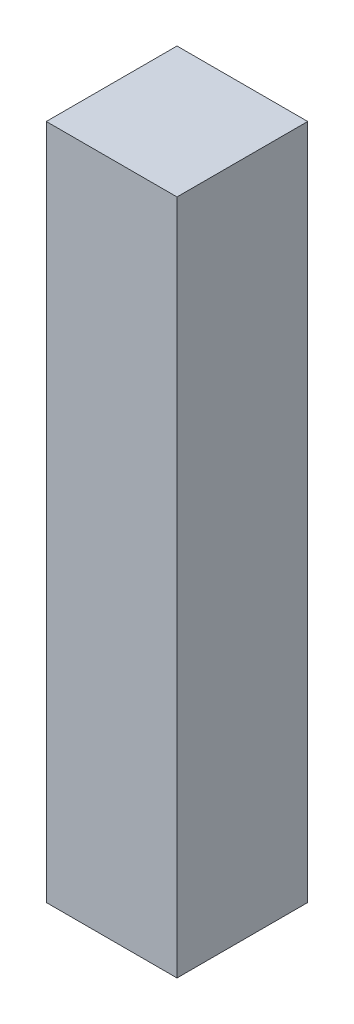
ISO-10303-21;
HEADER;
FILE_DESCRIPTION(('STEP AP214'),'2;1');
FILE_NAME('part.step','',(''),(''),'','','');
FILE_SCHEMA(('AUTOMOTIVE_DESIGN { 1 0 10303 214 1 1 1 1 }'));
ENDSEC;
DATA;
#1=APPLICATION_CONTEXT('core data for automotive mechanical design processes');
#2=APPLICATION_PROTOCOL_DEFINITION('international standard','automotive_design',2000,#1);
#3=PRODUCT_CONTEXT('',#1,'mechanical');
#4=PRODUCT('Part','Part','',(#3));
#5=PRODUCT_RELATED_PRODUCT_CATEGORY('part','',(#4));
#6=PRODUCT_DEFINITION_FORMATION('','',#4);
#7=PRODUCT_DEFINITION_CONTEXT('part definition',#1,'design');
#8=PRODUCT_DEFINITION('design','',#6,#7);
#9=PRODUCT_DEFINITION_SHAPE('','',#8);
#10=(LENGTH_UNIT() NAMED_UNIT(*) SI_UNIT(.MILLI.,.METRE.));
#11=(NAMED_UNIT(*) PLANE_ANGLE_UNIT() SI_UNIT($,.RADIAN.));
#12=(NAMED_UNIT(*) SI_UNIT($,.STERADIAN.) SOLID_ANGLE_UNIT());
#13=UNCERTAINTY_MEASURE_WITH_UNIT(LENGTH_MEASURE(1.E-05),#10,'distance_accuracy_value','');
#14=(GEOMETRIC_REPRESENTATION_CONTEXT(3) GLOBAL_UNCERTAINTY_ASSIGNED_CONTEXT((#13)) GLOBAL_UNIT_ASSIGNED_CONTEXT((#10,
#11,#12)) REPRESENTATION_CONTEXT('',''));
#15=CARTESIAN_POINT('',(0.,0.,0.));
#16=DIRECTION('',(0.,0.,1.));
#17=DIRECTION('',(1.,0.,0.));
#18=AXIS2_PLACEMENT_3D('',#15,#16,#17);
#19=CARTESIAN_POINT('',(0.,388.112,0.));
#20=DIRECTION('',(1.,0.,0.));
#21=DIRECTION('',(0.,0.,-1.));
#22=AXIS2_PLACEMENT_3D('',#19,#20,#21);
#23=PLANE('',#22);
#24=DIRECTION('',(0.,0.,1.));
#25=VECTOR('',#24,1.);
#26=CARTESIAN_POINT('',(0.,0.,0.));
#27=LINE('',#26,#25);
#28=CARTESIAN_POINT('',(0.,0.,-75.));
#29=VERTEX_POINT('',#28);
#30=CARTESIAN_POINT('',(0.,0.,0.));
#31=VERTEX_POINT('',#30);
#32=EDGE_CURVE('E97',#29,#31,#27,.T.);
#33=ORIENTED_EDGE('',*,*,#32,.T.);
#34=DIRECTION('',(0.,-1.,0.));
#35=VECTOR('',#34,1.);
#36=CARTESIAN_POINT('',(0.,388.112,0.));
#37=LINE('',#36,#35);
#38=CARTESIAN_POINT('',(0.,388.112,0.));
#39=VERTEX_POINT('',#38);
#40=EDGE_CURVE('E11',#39,#31,#37,.T.);
#41=ORIENTED_EDGE('',*,*,#40,.F.);
#42=DIRECTION('',(0.,0.,1.));
#43=VECTOR('',#42,1.);
#44=CARTESIAN_POINT('',(0.,388.112,0.));
#45=LINE('',#44,#43);
#46=CARTESIAN_POINT('',(0.,388.112,-75.));
#47=VERTEX_POINT('',#46);
#48=EDGE_CURVE('E85',#47,#39,#45,.T.);
#49=ORIENTED_EDGE('',*,*,#48,.F.);
#50=DIRECTION('',(0.,-1.,0.));
#51=VECTOR('',#50,1.);
#52=CARTESIAN_POINT('',(0.,388.112,-75.));
#53=LINE('',#52,#51);
#54=EDGE_CURVE('E93',#47,#29,#53,.T.);
#55=ORIENTED_EDGE('',*,*,#54,.T.);
#56=EDGE_LOOP('',(#33,#41,#49,#55));
#57=FACE_BOUND('',#56,.T.);
#58=ADVANCED_FACE('F34',(#57),#23,.F.);
#59=CARTESIAN_POINT('',(0.,388.112,0.));
#60=DIRECTION('',(0.,0.,-1.));
#61=DIRECTION('',(-1.,0.,0.));
#62=AXIS2_PLACEMENT_3D('',#59,#60,#61);
#63=PLANE('',#62);
#64=DIRECTION('',(1.,0.,0.));
#65=VECTOR('',#64,1.);
#66=CARTESIAN_POINT('',(0.,0.,0.));
#67=LINE('',#66,#65);
#68=CARTESIAN_POINT('',(75.,0.,0.));
#69=VERTEX_POINT('',#68);
#70=EDGE_CURVE('E89',#31,#69,#67,.T.);
#71=ORIENTED_EDGE('',*,*,#70,.T.);
#72=DIRECTION('',(0.,-1.,0.));
#73=VECTOR('',#72,1.);
#74=CARTESIAN_POINT('',(75.,388.112,0.));
#75=LINE('',#74,#73);
#76=CARTESIAN_POINT('',(75.,388.112,0.));
#77=VERTEX_POINT('',#76);
#78=EDGE_CURVE('E42',#77,#69,#75,.T.);
#79=ORIENTED_EDGE('',*,*,#78,.F.);
#80=DIRECTION('',(1.,0.,0.));
#81=VECTOR('',#80,1.);
#82=CARTESIAN_POINT('',(0.,388.112,0.));
#83=LINE('',#82,#81);
#84=EDGE_CURVE('E80',#39,#77,#83,.T.);
#85=ORIENTED_EDGE('',*,*,#84,.F.);
#86=ORIENTED_EDGE('',*,*,#40,.T.);
#87=EDGE_LOOP('',(#71,#79,#85,#86));
#88=FACE_BOUND('',#87,.T.);
#89=ADVANCED_FACE('F88',(#88),#63,.F.);
#90=CARTESIAN_POINT('',(75.,388.112,0.));
#91=DIRECTION('',(-1.,0.,0.));
#92=DIRECTION('',(0.,0.,1.));
#93=AXIS2_PLACEMENT_3D('',#90,#91,#92);
#94=PLANE('',#93);
#95=DIRECTION('',(0.,0.,-1.));
#96=VECTOR('',#95,1.);
#97=CARTESIAN_POINT('',(75.,0.,0.));
#98=LINE('',#97,#96);
#99=CARTESIAN_POINT('',(75.,0.,-75.));
#100=VERTEX_POINT('',#99);
#101=EDGE_CURVE('E67',#69,#100,#98,.T.);
#102=ORIENTED_EDGE('',*,*,#101,.T.);
#103=DIRECTION('',(0.,-1.,0.));
#104=VECTOR('',#103,1.);
#105=CARTESIAN_POINT('',(75.,388.112,-75.));
#106=LINE('',#105,#104);
#107=CARTESIAN_POINT('',(75.,388.112,-75.));
#108=VERTEX_POINT('',#107);
#109=EDGE_CURVE('E90',#108,#100,#106,.T.);
#110=ORIENTED_EDGE('',*,*,#109,.F.);
#111=DIRECTION('',(0.,0.,-1.));
#112=VECTOR('',#111,1.);
#113=CARTESIAN_POINT('',(75.,388.112,0.));
#114=LINE('',#113,#112);
#115=EDGE_CURVE('E83',#77,#108,#114,.T.);
#116=ORIENTED_EDGE('',*,*,#115,.F.);
#117=ORIENTED_EDGE('',*,*,#78,.T.);
#118=EDGE_LOOP('',(#102,#110,#116,#117));
#119=FACE_BOUND('',#118,.T.);
#120=ADVANCED_FACE('F91',(#119),#94,.F.);
#121=CARTESIAN_POINT('',(0.,388.112,-75.));
#122=DIRECTION('',(0.,0.,1.));
#123=DIRECTION('',(1.,0.,0.));
#124=AXIS2_PLACEMENT_3D('',#121,#122,#123);
#125=PLANE('',#124);
#126=DIRECTION('',(-1.,0.,0.));
#127=VECTOR('',#126,1.);
#128=CARTESIAN_POINT('',(0.,0.,-75.));
#129=LINE('',#128,#127);
#130=EDGE_CURVE('E73',#100,#29,#129,.T.);
#131=ORIENTED_EDGE('',*,*,#130,.T.);
#132=ORIENTED_EDGE('',*,*,#54,.F.);
#133=DIRECTION('',(-1.,0.,0.));
#134=VECTOR('',#133,1.);
#135=CARTESIAN_POINT('',(0.,388.112,-75.));
#136=LINE('',#135,#134);
#137=EDGE_CURVE('E50',#108,#47,#136,.T.);
#138=ORIENTED_EDGE('',*,*,#137,.F.);
#139=ORIENTED_EDGE('',*,*,#109,.T.);
#140=EDGE_LOOP('',(#131,#132,#138,#139));
#141=FACE_BOUND('',#140,.T.);
#142=ADVANCED_FACE('F104',(#141),#125,.F.);
#143=CARTESIAN_POINT('',(0.,388.112,0.));
#144=DIRECTION('',(0.,-1.,0.));
#145=DIRECTION('',(0.,0.,-1.));
#146=AXIS2_PLACEMENT_3D('',#143,#144,#145);
#147=PLANE('',#146);
#148=ORIENTED_EDGE('',*,*,#48,.T.);
#149=ORIENTED_EDGE('',*,*,#84,.T.);
#150=ORIENTED_EDGE('',*,*,#115,.T.);
#151=ORIENTED_EDGE('',*,*,#137,.T.);
#152=EDGE_LOOP('',(#148,#149,#150,#151));
#153=FACE_BOUND('',#152,.T.);
#154=ADVANCED_FACE('F81',(#153),#147,.F.);
#155=CARTESIAN_POINT('',(0.,0.,0.));
#156=DIRECTION('',(0.,-1.,0.));
#157=DIRECTION('',(0.,0.,-1.));
#158=AXIS2_PLACEMENT_3D('',#155,#156,#157);
#159=PLANE('',#158);
#160=ORIENTED_EDGE('',*,*,#32,.F.);
#161=ORIENTED_EDGE('',*,*,#130,.F.);
#162=ORIENTED_EDGE('',*,*,#101,.F.);
#163=ORIENTED_EDGE('',*,*,#70,.F.);
#164=EDGE_LOOP('',(#160,#161,#162,#163));
#165=FACE_BOUND('',#164,.T.);
#166=ADVANCED_FACE('F107',(#165),#159,.T.);
#167=CLOSED_SHELL('',(#58,#89,#120,#142,#154,#166));
#168=MANIFOLD_SOLID_BREP('B2',#167);
#169=ADVANCED_BREP_SHAPE_REPRESENTATION('',(#18,#168),#14);
#170=SHAPE_DEFINITION_REPRESENTATION(#9,#169);
ENDSEC;
END-ISO-10303-21;
